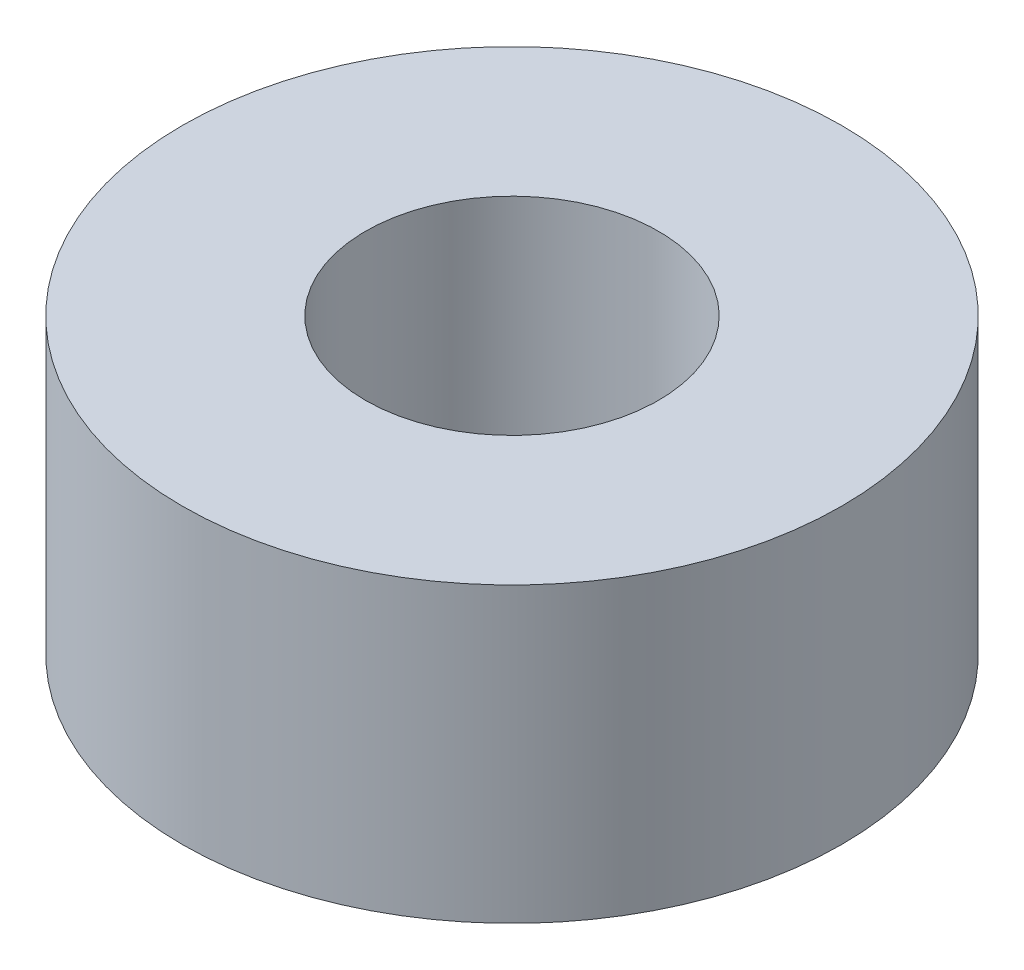
ISO-10303-21;
HEADER;
FILE_DESCRIPTION(('STEP AP214'),'2;1');
FILE_NAME('part.step','',(''),(''),'','','');
FILE_SCHEMA(('AUTOMOTIVE_DESIGN { 1 0 10303 214 1 1 1 1 }'));
ENDSEC;
DATA;
#1=APPLICATION_CONTEXT('core data for automotive mechanical design processes');
#2=APPLICATION_PROTOCOL_DEFINITION('international standard','automotive_design',2000,#1);
#3=PRODUCT_CONTEXT('',#1,'mechanical');
#4=PRODUCT('Part','Part','',(#3));
#5=PRODUCT_RELATED_PRODUCT_CATEGORY('part','',(#4));
#6=PRODUCT_DEFINITION_FORMATION('','',#4);
#7=PRODUCT_DEFINITION_CONTEXT('part definition',#1,'design');
#8=PRODUCT_DEFINITION('design','',#6,#7);
#9=PRODUCT_DEFINITION_SHAPE('','',#8);
#10=(LENGTH_UNIT() NAMED_UNIT(*) SI_UNIT(.MILLI.,.METRE.));
#11=(NAMED_UNIT(*) PLANE_ANGLE_UNIT() SI_UNIT($,.RADIAN.));
#12=(NAMED_UNIT(*) SI_UNIT($,.STERADIAN.) SOLID_ANGLE_UNIT());
#13=UNCERTAINTY_MEASURE_WITH_UNIT(LENGTH_MEASURE(1.E-05),#10,'distance_accuracy_value','');
#14=(GEOMETRIC_REPRESENTATION_CONTEXT(3) GLOBAL_UNCERTAINTY_ASSIGNED_CONTEXT((#13)) GLOBAL_UNIT_ASSIGNED_CONTEXT((#10,
#11,#12)) REPRESENTATION_CONTEXT('',''));
#15=CARTESIAN_POINT('',(0.,0.,0.));
#16=DIRECTION('',(0.,0.,1.));
#17=DIRECTION('',(1.,0.,0.));
#18=AXIS2_PLACEMENT_3D('',#15,#16,#17);
#19=CARTESIAN_POINT('',(0.,4.,0.));
#20=DIRECTION('',(0.,1.,0.));
#21=DIRECTION('',(0.,0.,1.));
#22=AXIS2_PLACEMENT_3D('',#19,#20,#21);
#23=PLANE('',#22);
#24=CARTESIAN_POINT('',(0.,4.,0.));
#25=DIRECTION('',(0.,1.,0.));
#26=DIRECTION('',(0.,0.,1.));
#27=AXIS2_PLACEMENT_3D('',#24,#25,#26);
#28=CIRCLE('',#27,4.5);
#29=CARTESIAN_POINT('',(0.,4.,4.5));
#30=VERTEX_POINT('',#29);
#31=EDGE_CURVE('E10',#30,#30,#28,.T.);
#32=ORIENTED_EDGE('',*,*,#31,.T.);
#33=EDGE_LOOP('',(#32));
#34=FACE_BOUND('',#33,.T.);
#35=CARTESIAN_POINT('',(0.,4.,0.));
#36=DIRECTION('',(0.,1.,0.));
#37=DIRECTION('',(0.,0.,1.));
#38=AXIS2_PLACEMENT_3D('',#35,#36,#37);
#39=CIRCLE('',#38,2.);
#40=CARTESIAN_POINT('',(0.,4.,2.));
#41=VERTEX_POINT('',#40);
#42=EDGE_CURVE('E42',#41,#41,#39,.T.);
#43=ORIENTED_EDGE('',*,*,#42,.F.);
#44=EDGE_LOOP('',(#43));
#45=FACE_BOUND('',#44,.T.);
#46=ADVANCED_FACE('F31',(#34,#45),#23,.T.);
#47=CARTESIAN_POINT('',(0.,0.,0.));
#48=DIRECTION('',(0.,1.,0.));
#49=DIRECTION('',(0.,0.,1.));
#50=AXIS2_PLACEMENT_3D('',#47,#48,#49);
#51=PLANE('',#50);
#52=CARTESIAN_POINT('',(0.,0.,0.));
#53=DIRECTION('',(0.,1.,0.));
#54=DIRECTION('',(0.,0.,1.));
#55=AXIS2_PLACEMENT_3D('',#52,#53,#54);
#56=CIRCLE('',#55,4.5);
#57=CARTESIAN_POINT('',(0.,0.,4.5));
#58=VERTEX_POINT('',#57);
#59=EDGE_CURVE('E35',#58,#58,#56,.T.);
#60=ORIENTED_EDGE('',*,*,#59,.F.);
#61=EDGE_LOOP('',(#60));
#62=FACE_BOUND('',#61,.T.);
#63=CARTESIAN_POINT('',(0.,0.,0.));
#64=DIRECTION('',(0.,1.,0.));
#65=DIRECTION('',(0.,0.,1.));
#66=AXIS2_PLACEMENT_3D('',#63,#64,#65);
#67=CIRCLE('',#66,2.);
#68=CARTESIAN_POINT('',(0.,0.,2.));
#69=VERTEX_POINT('',#68);
#70=EDGE_CURVE('E44',#69,#69,#67,.T.);
#71=ORIENTED_EDGE('',*,*,#70,.T.);
#72=EDGE_LOOP('',(#71));
#73=FACE_BOUND('',#72,.T.);
#74=ADVANCED_FACE('F54',(#62,#73),#51,.F.);
#75=CARTESIAN_POINT('',(0.,4.,0.));
#76=DIRECTION('',(0.,-1.,0.));
#77=DIRECTION('',(0.,0.,-1.));
#78=AXIS2_PLACEMENT_3D('',#75,#76,#77);
#79=CYLINDRICAL_SURFACE('',#78,4.5);
#80=ORIENTED_EDGE('',*,*,#31,.F.);
#81=EDGE_LOOP('',(#80));
#82=FACE_BOUND('',#81,.T.);
#83=ORIENTED_EDGE('',*,*,#59,.T.);
#84=EDGE_LOOP('',(#83));
#85=FACE_BOUND('',#84,.T.);
#86=ADVANCED_FACE('F33',(#82,#85),#79,.T.);
#87=CARTESIAN_POINT('',(0.,4.,0.));
#88=DIRECTION('',(0.,-1.,0.));
#89=DIRECTION('',(0.,0.,-1.));
#90=AXIS2_PLACEMENT_3D('',#87,#88,#89);
#91=CYLINDRICAL_SURFACE('',#90,2.);
#92=ORIENTED_EDGE('',*,*,#42,.T.);
#93=EDGE_LOOP('',(#92));
#94=FACE_BOUND('',#93,.T.);
#95=ORIENTED_EDGE('',*,*,#70,.F.);
#96=EDGE_LOOP('',(#95));
#97=FACE_BOUND('',#96,.T.);
#98=ADVANCED_FACE('F50',(#94,#97),#91,.F.);
#99=CLOSED_SHELL('',(#46,#74,#86,#98));
#100=MANIFOLD_SOLID_BREP('B2',#99);
#101=ADVANCED_BREP_SHAPE_REPRESENTATION('',(#18,#100),#14);
#102=SHAPE_DEFINITION_REPRESENTATION(#9,#101);
ENDSEC;
END-ISO-10303-21;
